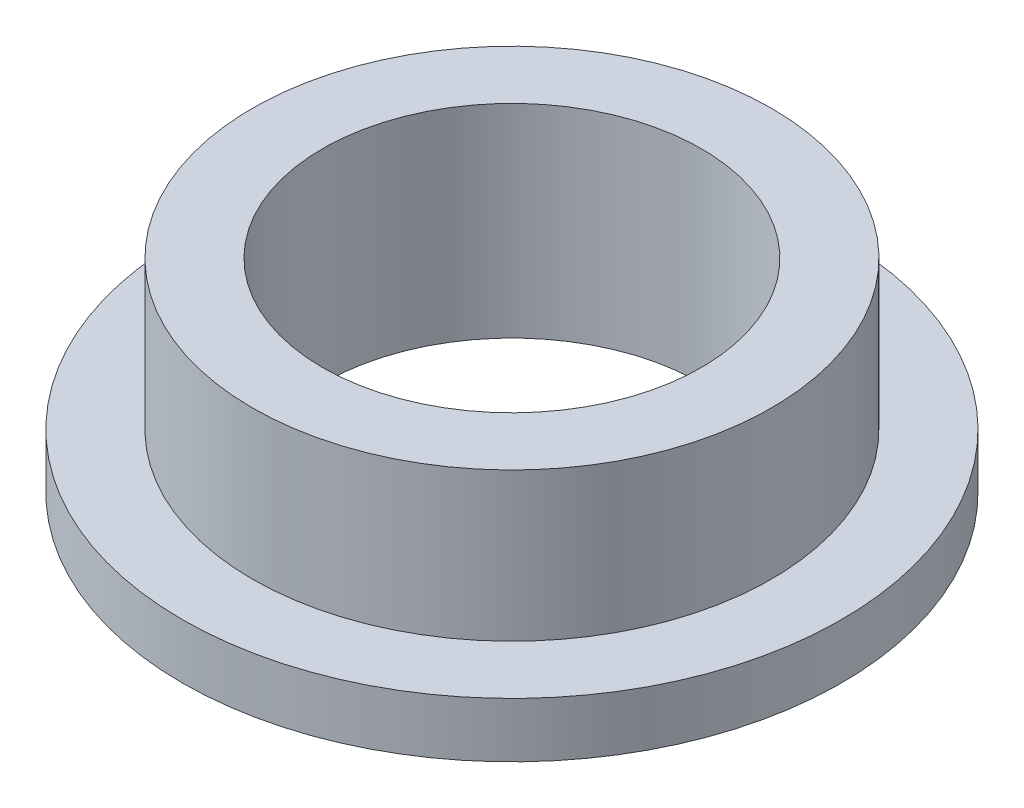
ISO-10303-21;
HEADER;
FILE_DESCRIPTION(('STEP AP214'),'2;1');
FILE_NAME('part.step','',(''),(''),'','','');
FILE_SCHEMA(('AUTOMOTIVE_DESIGN { 1 0 10303 214 1 1 1 1 }'));
ENDSEC;
DATA;
#1=APPLICATION_CONTEXT('core data for automotive mechanical design processes');
#2=APPLICATION_PROTOCOL_DEFINITION('international standard','automotive_design',2000,#1);
#3=PRODUCT_CONTEXT('',#1,'mechanical');
#4=PRODUCT('Part','Part','',(#3));
#5=PRODUCT_RELATED_PRODUCT_CATEGORY('part','',(#4));
#6=PRODUCT_DEFINITION_FORMATION('','',#4);
#7=PRODUCT_DEFINITION_CONTEXT('part definition',#1,'design');
#8=PRODUCT_DEFINITION('design','',#6,#7);
#9=PRODUCT_DEFINITION_SHAPE('','',#8);
#10=(LENGTH_UNIT() NAMED_UNIT(*) SI_UNIT(.MILLI.,.METRE.));
#11=(NAMED_UNIT(*) PLANE_ANGLE_UNIT() SI_UNIT($,.RADIAN.));
#12=(NAMED_UNIT(*) SI_UNIT($,.STERADIAN.) SOLID_ANGLE_UNIT());
#13=UNCERTAINTY_MEASURE_WITH_UNIT(LENGTH_MEASURE(1.E-05),#10,'distance_accuracy_value','');
#14=(GEOMETRIC_REPRESENTATION_CONTEXT(3) GLOBAL_UNCERTAINTY_ASSIGNED_CONTEXT((#13)) GLOBAL_UNIT_ASSIGNED_CONTEXT((#10,
#11,#12)) REPRESENTATION_CONTEXT('',''));
#15=CARTESIAN_POINT('',(0.,0.,0.));
#16=DIRECTION('',(0.,0.,1.));
#17=DIRECTION('',(1.,0.,0.));
#18=AXIS2_PLACEMENT_3D('',#15,#16,#17);
#19=CARTESIAN_POINT('',(0.,1.,0.));
#20=DIRECTION('',(0.,-1.,0.));
#21=DIRECTION('',(0.,0.,-1.));
#22=AXIS2_PLACEMENT_3D('',#19,#20,#21);
#23=CYLINDRICAL_SURFACE('',#22,6.00000000000001);
#24=CARTESIAN_POINT('',(0.,1.,0.));
#25=DIRECTION('',(0.,1.,0.));
#26=DIRECTION('',(0.,0.,1.));
#27=AXIS2_PLACEMENT_3D('',#24,#25,#26);
#28=CIRCLE('',#27,6.00000000000001);
#29=CARTESIAN_POINT('',(0.,1.,6.00000000000001));
#30=VERTEX_POINT('',#29);
#31=EDGE_CURVE('E45',#30,#30,#28,.T.);
#32=ORIENTED_EDGE('',*,*,#31,.F.);
#33=EDGE_LOOP('',(#32));
#34=FACE_BOUND('',#33,.T.);
#35=CARTESIAN_POINT('',(0.,0.,0.));
#36=DIRECTION('',(0.,1.,0.));
#37=DIRECTION('',(0.,0.,1.));
#38=AXIS2_PLACEMENT_3D('',#35,#36,#37);
#39=CIRCLE('',#38,6.00000000000001);
#40=CARTESIAN_POINT('',(0.,0.,6.00000000000001));
#41=VERTEX_POINT('',#40);
#42=EDGE_CURVE('E40',#41,#41,#39,.T.);
#43=ORIENTED_EDGE('',*,*,#42,.T.);
#44=EDGE_LOOP('',(#43));
#45=FACE_BOUND('',#44,.T.);
#46=ADVANCED_FACE('F37',(#34,#45),#23,.T.);
#47=CARTESIAN_POINT('',(0.,1.,0.));
#48=DIRECTION('',(0.,1.,0.));
#49=DIRECTION('',(0.,0.,1.));
#50=AXIS2_PLACEMENT_3D('',#47,#48,#49);
#51=PLANE('',#50);
#52=CARTESIAN_POINT('',(0.,1.,0.));
#53=DIRECTION('',(0.,1.,0.));
#54=DIRECTION('',(0.,0.,1.));
#55=AXIS2_PLACEMENT_3D('',#52,#53,#54);
#56=CIRCLE('',#55,4.725);
#57=CARTESIAN_POINT('',(0.,1.,-4.725));
#58=VERTEX_POINT('',#57);
#59=EDGE_CURVE('E10',#58,#58,#56,.T.);
#60=ORIENTED_EDGE('',*,*,#59,.F.);
#61=EDGE_LOOP('',(#60));
#62=FACE_BOUND('',#61,.T.);
#63=ORIENTED_EDGE('',*,*,#31,.T.);
#64=EDGE_LOOP('',(#63));
#65=FACE_BOUND('',#64,.T.);
#66=ADVANCED_FACE('F86',(#62,#65),#51,.T.);
#67=CARTESIAN_POINT('',(0.,0.,0.));
#68=DIRECTION('',(0.,1.,0.));
#69=DIRECTION('',(0.,0.,1.));
#70=AXIS2_PLACEMENT_3D('',#67,#68,#69);
#71=PLANE('',#70);
#72=CARTESIAN_POINT('',(0.,0.,0.));
#73=DIRECTION('',(0.,1.,0.));
#74=DIRECTION('',(0.,0.,1.));
#75=AXIS2_PLACEMENT_3D('',#72,#73,#74);
#76=CIRCLE('',#75,3.45);
#77=CARTESIAN_POINT('',(0.,0.,3.45));
#78=VERTEX_POINT('',#77);
#79=EDGE_CURVE('E56',#78,#78,#76,.T.);
#80=ORIENTED_EDGE('',*,*,#79,.T.);
#81=EDGE_LOOP('',(#80));
#82=FACE_BOUND('',#81,.T.);
#83=ORIENTED_EDGE('',*,*,#42,.F.);
#84=EDGE_LOOP('',(#83));
#85=FACE_BOUND('',#84,.T.);
#86=ADVANCED_FACE('F65',(#82,#85),#71,.F.);
#87=CARTESIAN_POINT('',(0.,3.7,0.));
#88=DIRECTION('',(0.,-1.,0.));
#89=DIRECTION('',(0.,0.,-1.));
#90=AXIS2_PLACEMENT_3D('',#87,#88,#89);
#91=CYLINDRICAL_SURFACE('',#90,4.725);
#92=CARTESIAN_POINT('',(0.,3.7,0.));
#93=DIRECTION('',(0.,1.,0.));
#94=DIRECTION('',(0.,0.,1.));
#95=AXIS2_PLACEMENT_3D('',#92,#93,#94);
#96=CIRCLE('',#95,4.725);
#97=CARTESIAN_POINT('',(0.,3.7,-4.725));
#98=VERTEX_POINT('',#97);
#99=EDGE_CURVE('E52',#98,#98,#96,.T.);
#100=CARTESIAN_POINT('',(0.,3.7,-4.725));
#101=CARTESIAN_POINT('',(0.,3.671875,-4.725));
#102=CARTESIAN_POINT('',(0.,3.64375,-4.725));
#103=CARTESIAN_POINT('',(0.,3.5875,-4.725));
#104=CARTESIAN_POINT('',(0.,3.559375,-4.725));
#105=CARTESIAN_POINT('',(0.,3.503125,-4.725));
#106=CARTESIAN_POINT('',(0.,3.475,-4.725));
#107=CARTESIAN_POINT('',(0.,3.41875,-4.725));
#108=CARTESIAN_POINT('',(0.,3.390625,-4.725));
#109=CARTESIAN_POINT('',(0.,3.334375,-4.725));
#110=CARTESIAN_POINT('',(0.,3.30625,-4.725));
#111=CARTESIAN_POINT('',(0.,3.25,-4.725));
#112=CARTESIAN_POINT('',(0.,3.221875,-4.725));
#113=CARTESIAN_POINT('',(0.,3.165625,-4.725));
#114=CARTESIAN_POINT('',(0.,3.1375,-4.725));
#115=CARTESIAN_POINT('',(0.,3.08125,-4.725));
#116=CARTESIAN_POINT('',(0.,3.053125,-4.725));
#117=CARTESIAN_POINT('',(0.,2.996875,-4.725));
#118=CARTESIAN_POINT('',(0.,2.96875,-4.725));
#119=CARTESIAN_POINT('',(0.,2.9125,-4.725));
#120=CARTESIAN_POINT('',(0.,2.884375,-4.725));
#121=CARTESIAN_POINT('',(0.,2.828125,-4.725));
#122=CARTESIAN_POINT('',(0.,2.8,-4.725));
#123=CARTESIAN_POINT('',(0.,2.74375,-4.725));
#124=CARTESIAN_POINT('',(0.,2.715625,-4.725));
#125=CARTESIAN_POINT('',(0.,2.659375,-4.725));
#126=CARTESIAN_POINT('',(0.,2.63125,-4.725));
#127=CARTESIAN_POINT('',(0.,2.575,-4.725));
#128=CARTESIAN_POINT('',(0.,2.546875,-4.725));
#129=CARTESIAN_POINT('',(0.,2.490625,-4.725));
#130=CARTESIAN_POINT('',(0.,2.4625,-4.725));
#131=CARTESIAN_POINT('',(0.,2.40625,-4.725));
#132=CARTESIAN_POINT('',(0.,2.378125,-4.725));
#133=CARTESIAN_POINT('',(0.,2.321875,-4.725));
#134=CARTESIAN_POINT('',(0.,2.29375,-4.725));
#135=CARTESIAN_POINT('',(0.,2.2375,-4.725));
#136=CARTESIAN_POINT('',(0.,2.209375,-4.725));
#137=CARTESIAN_POINT('',(0.,2.153125,-4.725));
#138=CARTESIAN_POINT('',(0.,2.125,-4.725));
#139=CARTESIAN_POINT('',(0.,2.06875,-4.725));
#140=CARTESIAN_POINT('',(0.,2.040625,-4.725));
#141=CARTESIAN_POINT('',(0.,1.984375,-4.725));
#142=CARTESIAN_POINT('',(0.,1.95625,-4.725));
#143=CARTESIAN_POINT('',(0.,1.9,-4.725));
#144=CARTESIAN_POINT('',(0.,1.871875,-4.725));
#145=CARTESIAN_POINT('',(0.,1.815625,-4.725));
#146=CARTESIAN_POINT('',(0.,1.7875,-4.725));
#147=CARTESIAN_POINT('',(0.,1.73125,-4.725));
#148=CARTESIAN_POINT('',(0.,1.703125,-4.725));
#149=CARTESIAN_POINT('',(0.,1.646875,-4.725));
#150=CARTESIAN_POINT('',(0.,1.61875,-4.725));
#151=CARTESIAN_POINT('',(0.,1.5625,-4.725));
#152=CARTESIAN_POINT('',(0.,1.534375,-4.725));
#153=CARTESIAN_POINT('',(0.,1.478125,-4.725));
#154=CARTESIAN_POINT('',(0.,1.45,-4.725));
#155=CARTESIAN_POINT('',(0.,1.39375,-4.725));
#156=CARTESIAN_POINT('',(0.,1.365625,-4.725));
#157=CARTESIAN_POINT('',(0.,1.309375,-4.725));
#158=CARTESIAN_POINT('',(0.,1.28125,-4.725));
#159=CARTESIAN_POINT('',(0.,1.225,-4.725));
#160=CARTESIAN_POINT('',(0.,1.196875,-4.725));
#161=CARTESIAN_POINT('',(0.,1.140625,-4.725));
#162=CARTESIAN_POINT('',(0.,1.1125,-4.725));
#163=CARTESIAN_POINT('',(0.,1.05625,-4.725));
#164=CARTESIAN_POINT('',(0.,1.028125,-4.725));
#165=CARTESIAN_POINT('',(0.,1.,-4.725));
#166=B_SPLINE_CURVE_WITH_KNOTS('',3,(#100,#101,#102,#103,#104,#105,#106,#107,#108,#109,#110,
#111,#112,#113,#114,#115,#116,#117,#118,#119,#120,#121,#122,#123,#124,#125,#126,#127,#128,#129,
#130,#131,#132,#133,#134,#135,#136,#137,#138,#139,#140,#141,#142,#143,#144,#145,#146,#147,#148,
#149,#150,#151,#152,#153,#154,#155,#156,#157,#158,#159,#160,#161,#162,#163,#164,#165),
.UNSPECIFIED.,.F.,.F.,(4,2,2,2,2,2,2,2,2,2,2,2,2,2,2,2,2,2,2,2,2,2,2,2,2,2,2,2,2,2,2,2,4),(0.,
0.0843750000000003,0.16875,0.253125,0.3375,0.421875,0.50625,0.590625,0.675,0.759375,0.84375,
0.928125000000001,1.0125,1.096875,1.18125,1.265625,1.35,1.434375,1.51875,1.603125,1.6875,
1.771875,1.85625,1.940625,2.025,2.109375,2.19375,2.278125,2.3625,2.446875,2.53125,2.615625,2.7),.UNSPECIFIED.);
#167=EDGE_CURVE('BSEAM77',#98,#58,#166,.T.);
#168=ORIENTED_EDGE('',*,*,#99,.F.);
#169=ORIENTED_EDGE('',*,*,#59,.T.);
#170=ORIENTED_EDGE('',*,*,#167,.T.);
#171=ORIENTED_EDGE('',*,*,#167,.F.);
#172=EDGE_LOOP('',(#168,#170,#169,#171));
#173=FACE_BOUND('',#172,.T.);
#174=ADVANCED_FACE('F77',(#173),#91,.T.);
#175=CARTESIAN_POINT('',(0.,3.7,0.));
#176=DIRECTION('',(0.,1.,0.));
#177=DIRECTION('',(0.,0.,1.));
#178=AXIS2_PLACEMENT_3D('',#175,#176,#177);
#179=PLANE('',#178);
#180=CARTESIAN_POINT('',(0.,3.7,0.));
#181=DIRECTION('',(0.,1.,0.));
#182=DIRECTION('',(0.,0.,1.));
#183=AXIS2_PLACEMENT_3D('',#180,#181,#182);
#184=CIRCLE('',#183,3.45);
#185=CARTESIAN_POINT('',(0.,3.7,3.45));
#186=VERTEX_POINT('',#185);
#187=EDGE_CURVE('E57',#186,#186,#184,.T.);
#188=ORIENTED_EDGE('',*,*,#187,.F.);
#189=EDGE_LOOP('',(#188));
#190=FACE_BOUND('',#189,.T.);
#191=ORIENTED_EDGE('',*,*,#99,.T.);
#192=EDGE_LOOP('',(#191));
#193=FACE_BOUND('',#192,.T.);
#194=ADVANCED_FACE('F71',(#190,#193),#179,.T.);
#195=CARTESIAN_POINT('',(0.,0.,0.));
#196=DIRECTION('',(0.,1.,0.));
#197=DIRECTION('',(0.,0.,1.));
#198=AXIS2_PLACEMENT_3D('',#195,#196,#197);
#199=CYLINDRICAL_SURFACE('',#198,3.45);
#200=ORIENTED_EDGE('',*,*,#79,.F.);
#201=EDGE_LOOP('',(#200));
#202=FACE_BOUND('',#201,.T.);
#203=ORIENTED_EDGE('',*,*,#187,.T.);
#204=EDGE_LOOP('',(#203));
#205=FACE_BOUND('',#204,.T.);
#206=ADVANCED_FACE('F68',(#202,#205),#199,.F.);
#207=CLOSED_SHELL('',(#46,#66,#86,#174,#194,#206));
#208=MANIFOLD_SOLID_BREP('B2',#207);
#209=ADVANCED_BREP_SHAPE_REPRESENTATION('',(#18,#208),#14);
#210=SHAPE_DEFINITION_REPRESENTATION(#9,#209);
ENDSEC;
END-ISO-10303-21;
